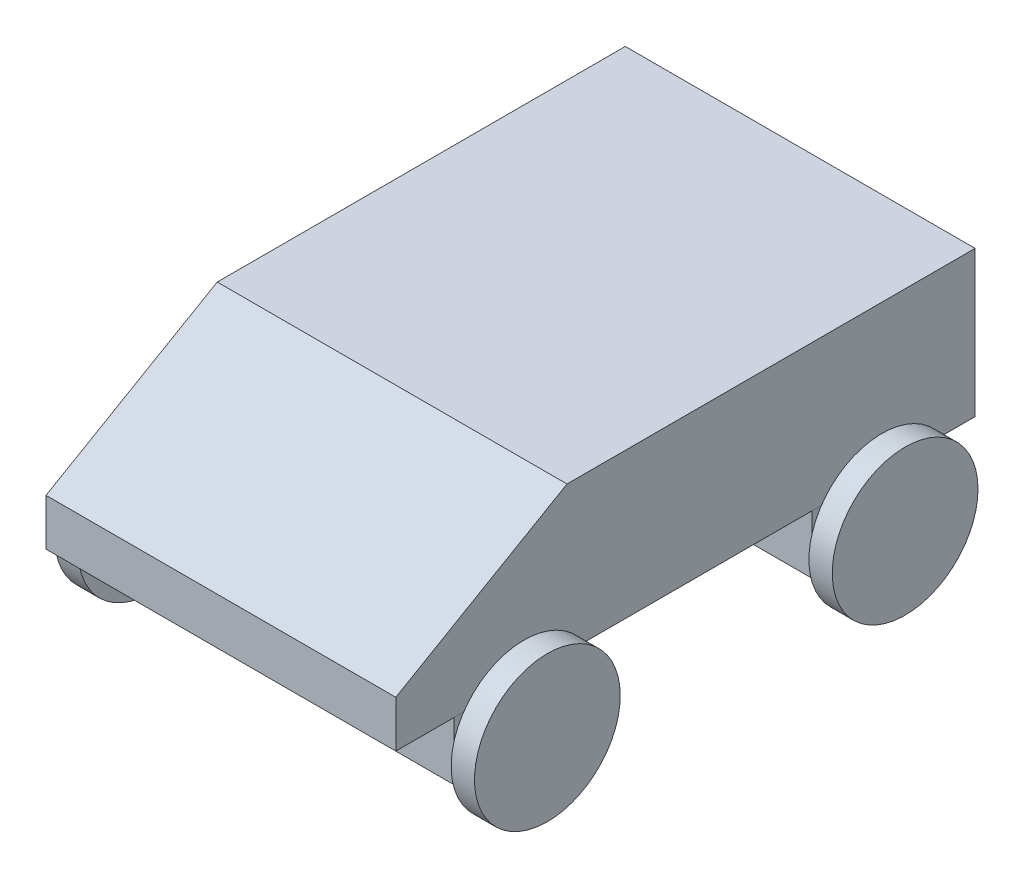
ISO-10303-21;
HEADER;
FILE_DESCRIPTION(('STEP AP214'),'2;1');
FILE_NAME('part.step','',(''),(''),'','','');
FILE_SCHEMA(('AUTOMOTIVE_DESIGN { 1 0 10303 214 1 1 1 1 }'));
ENDSEC;
DATA;
#1=APPLICATION_CONTEXT('core data for automotive mechanical design processes');
#2=APPLICATION_PROTOCOL_DEFINITION('international standard','automotive_design',2000,#1);
#3=PRODUCT_CONTEXT('',#1,'mechanical');
#4=PRODUCT('Part','Part','',(#3));
#5=PRODUCT_RELATED_PRODUCT_CATEGORY('part','',(#4));
#6=PRODUCT_DEFINITION_FORMATION('','',#4);
#7=PRODUCT_DEFINITION_CONTEXT('part definition',#1,'design');
#8=PRODUCT_DEFINITION('design','',#6,#7);
#9=PRODUCT_DEFINITION_SHAPE('','',#8);
#10=(LENGTH_UNIT() NAMED_UNIT(*) SI_UNIT(.MILLI.,.METRE.));
#11=(NAMED_UNIT(*) PLANE_ANGLE_UNIT() SI_UNIT($,.RADIAN.));
#12=(NAMED_UNIT(*) SI_UNIT($,.STERADIAN.) SOLID_ANGLE_UNIT());
#13=UNCERTAINTY_MEASURE_WITH_UNIT(LENGTH_MEASURE(1.E-05),#10,'distance_accuracy_value','');
#14=(GEOMETRIC_REPRESENTATION_CONTEXT(3) GLOBAL_UNCERTAINTY_ASSIGNED_CONTEXT((#13)) GLOBAL_UNIT_ASSIGNED_CONTEXT((#10,
#11,#12)) REPRESENTATION_CONTEXT('',''));
#15=CARTESIAN_POINT('',(0.,0.,0.));
#16=DIRECTION('',(0.,0.,1.));
#17=DIRECTION('',(1.,0.,0.));
#18=AXIS2_PLACEMENT_3D('',#15,#16,#17);
#19=CARTESIAN_POINT('',(0.,0.,0.));
#20=DIRECTION('',(-1.,0.,0.));
#21=DIRECTION('',(0.,0.,1.));
#22=AXIS2_PLACEMENT_3D('',#19,#20,#21);
#23=PLANE('',#22);
#24=DIRECTION('',(0.,0.,-1.));
#25=VECTOR('',#24,1.);
#26=CARTESIAN_POINT('',(0.,0.,37.3));
#27=LINE('',#26,#25);
#28=CARTESIAN_POINT('',(0.,0.,37.3));
#29=VERTEX_POINT('',#28);
#30=CARTESIAN_POINT('',(0.,0.,11.9));
#31=VERTEX_POINT('',#30);
#32=EDGE_CURVE('E12',#29,#31,#27,.T.);
#33=ORIENTED_EDGE('',*,*,#32,.T.);
#34=DIRECTION('',(0.,1.,0.));
#35=VECTOR('',#34,1.);
#36=CARTESIAN_POINT('',(0.,-12.7,11.9));
#37=LINE('',#36,#35);
#38=CARTESIAN_POINT('',(0.,-12.7,11.9));
#39=VERTEX_POINT('',#38);
#40=EDGE_CURVE('E121',#39,#31,#37,.T.);
#41=ORIENTED_EDGE('',*,*,#40,.F.);
#42=DIRECTION('',(0.,0.,-1.));
#43=VECTOR('',#42,1.);
#44=CARTESIAN_POINT('',(0.,-12.7,37.3));
#45=LINE('',#44,#43);
#46=CARTESIAN_POINT('',(0.,-12.7,37.3));
#47=VERTEX_POINT('',#46);
#48=EDGE_CURVE('E53',#47,#39,#45,.T.);
#49=ORIENTED_EDGE('',*,*,#48,.F.);
#50=DIRECTION('',(0.,1.,0.));
#51=VECTOR('',#50,1.);
#52=CARTESIAN_POINT('',(0.,-12.7,37.3));
#53=LINE('',#52,#51);
#54=EDGE_CURVE('E108',#47,#29,#53,.T.);
#55=ORIENTED_EDGE('',*,*,#54,.T.);
#56=EDGE_LOOP('',(#33,#41,#49,#55));
#57=FACE_BOUND('',#56,.T.);
#58=ADVANCED_FACE('F50',(#57),#23,.T.);
#59=CARTESIAN_POINT('',(0.,-12.7,11.9));
#60=DIRECTION('',(0.,0.,1.));
#61=DIRECTION('',(1.,0.,0.));
#62=AXIS2_PLACEMENT_3D('',#59,#60,#61);
#63=PLANE('',#62);
#64=DIRECTION('',(1.,0.,0.));
#65=VECTOR('',#64,1.);
#66=CARTESIAN_POINT('',(0.,0.,11.9));
#67=LINE('',#66,#65);
#68=CARTESIAN_POINT('',(19.05,0.,11.9));
#69=VERTEX_POINT('',#68);
#70=EDGE_CURVE('E59',#31,#69,#67,.T.);
#71=ORIENTED_EDGE('',*,*,#70,.T.);
#72=DIRECTION('',(0.,1.,0.));
#73=VECTOR('',#72,1.);
#74=CARTESIAN_POINT('',(19.05,-12.7,11.9));
#75=LINE('',#74,#73);
#76=CARTESIAN_POINT('',(19.05,-12.7,11.9));
#77=VERTEX_POINT('',#76);
#78=EDGE_CURVE('E104',#77,#69,#75,.T.);
#79=ORIENTED_EDGE('',*,*,#78,.F.);
#80=DIRECTION('',(1.,0.,0.));
#81=VECTOR('',#80,1.);
#82=CARTESIAN_POINT('',(0.,-12.7,11.9));
#83=LINE('',#82,#81);
#84=EDGE_CURVE('E83',#39,#77,#83,.T.);
#85=ORIENTED_EDGE('',*,*,#84,.F.);
#86=ORIENTED_EDGE('',*,*,#40,.T.);
#87=EDGE_LOOP('',(#71,#79,#85,#86));
#88=FACE_BOUND('',#87,.T.);
#89=ADVANCED_FACE('F124',(#88),#63,.F.);
#90=CARTESIAN_POINT('',(19.05,-12.7,37.3));
#91=DIRECTION('',(-1.,0.,0.));
#92=DIRECTION('',(0.,0.,1.));
#93=AXIS2_PLACEMENT_3D('',#90,#91,#92);
#94=PLANE('',#93);
#95=DIRECTION('',(0.,0.,1.));
#96=VECTOR('',#95,1.);
#97=CARTESIAN_POINT('',(19.05,0.,37.3));
#98=LINE('',#97,#96);
#99=CARTESIAN_POINT('',(19.05,0.,37.3));
#100=VERTEX_POINT('',#99);
#101=EDGE_CURVE('E99',#69,#100,#98,.T.);
#102=ORIENTED_EDGE('',*,*,#101,.T.);
#103=DIRECTION('',(0.,1.,0.));
#104=VECTOR('',#103,1.);
#105=CARTESIAN_POINT('',(19.05,-12.7,37.3));
#106=LINE('',#105,#104);
#107=CARTESIAN_POINT('',(19.05,-12.7,37.3));
#108=VERTEX_POINT('',#107);
#109=EDGE_CURVE('E102',#108,#100,#106,.T.);
#110=ORIENTED_EDGE('',*,*,#109,.F.);
#111=DIRECTION('',(0.,0.,1.));
#112=VECTOR('',#111,1.);
#113=CARTESIAN_POINT('',(19.05,-12.7,37.3));
#114=LINE('',#113,#112);
#115=EDGE_CURVE('E116',#77,#108,#114,.T.);
#116=ORIENTED_EDGE('',*,*,#115,.F.);
#117=ORIENTED_EDGE('',*,*,#78,.T.);
#118=EDGE_LOOP('',(#102,#110,#116,#117));
#119=FACE_BOUND('',#118,.T.);
#120=ADVANCED_FACE('F100',(#119),#94,.F.);
#121=CARTESIAN_POINT('',(0.,-12.7,37.3));
#122=DIRECTION('',(0.,0.,-1.));
#123=DIRECTION('',(-1.,0.,0.));
#124=AXIS2_PLACEMENT_3D('',#121,#122,#123);
#125=PLANE('',#124);
#126=DIRECTION('',(-1.,0.,0.));
#127=VECTOR('',#126,1.);
#128=CARTESIAN_POINT('',(0.,0.,37.3));
#129=LINE('',#128,#127);
#130=EDGE_CURVE('E93',#100,#29,#129,.T.);
#131=ORIENTED_EDGE('',*,*,#130,.T.);
#132=ORIENTED_EDGE('',*,*,#54,.F.);
#133=DIRECTION('',(-1.,0.,0.));
#134=VECTOR('',#133,1.);
#135=CARTESIAN_POINT('',(0.,-12.7,37.3));
#136=LINE('',#135,#134);
#137=EDGE_CURVE('E107',#108,#47,#136,.T.);
#138=ORIENTED_EDGE('',*,*,#137,.F.);
#139=ORIENTED_EDGE('',*,*,#109,.T.);
#140=EDGE_LOOP('',(#131,#132,#138,#139));
#141=FACE_BOUND('',#140,.T.);
#142=ADVANCED_FACE('F106',(#141),#125,.F.);
#143=CARTESIAN_POINT('',(0.,-12.7,0.));
#144=DIRECTION('',(0.,-1.,0.));
#145=DIRECTION('',(0.,0.,-1.));
#146=AXIS2_PLACEMENT_3D('',#143,#144,#145);
#147=PLANE('',#146);
#148=ORIENTED_EDGE('',*,*,#48,.T.);
#149=ORIENTED_EDGE('',*,*,#84,.T.);
#150=ORIENTED_EDGE('',*,*,#115,.T.);
#151=ORIENTED_EDGE('',*,*,#137,.T.);
#152=EDGE_LOOP('',(#148,#149,#150,#151));
#153=FACE_BOUND('',#152,.T.);
#154=ADVANCED_FACE('F117',(#153),#147,.T.);
#155=CARTESIAN_POINT('',(0.,0.,0.));
#156=DIRECTION('',(0.,-1.,0.));
#157=DIRECTION('',(0.,0.,-1.));
#158=AXIS2_PLACEMENT_3D('',#155,#156,#157);
#159=PLANE('',#158);
#160=ORIENTED_EDGE('',*,*,#32,.F.);
#161=ORIENTED_EDGE('',*,*,#130,.F.);
#162=ORIENTED_EDGE('',*,*,#101,.F.);
#163=ORIENTED_EDGE('',*,*,#70,.F.);
#164=EDGE_LOOP('',(#160,#161,#162,#163));
#165=FACE_BOUND('',#164,.T.);
#166=ADVANCED_FACE('F110',(#165),#159,.F.);
#167=CLOSED_SHELL('',(#58,#89,#120,#142,#154,#166));
#168=MANIFOLD_SOLID_BREP('B2',#167);
#169=CARTESIAN_POINT('',(0.,0.,0.));
#170=DIRECTION('',(-1.,0.,0.));
#171=DIRECTION('',(0.,0.,1.));
#172=AXIS2_PLACEMENT_3D('',#169,#170,#171);
#173=PLANE('',#172);
#174=CARTESIAN_POINT('',(0.,-6.35,24.6));
#175=DIRECTION('',(1.,0.,0.));
#176=DIRECTION('',(0.,0.,-1.));
#177=AXIS2_PLACEMENT_3D('',#174,#175,#176);
#178=CIRCLE('',#177,2.54);
#179=CARTESIAN_POINT('',(0.,-6.35,22.06));
#180=VERTEX_POINT('',#179);
#181=EDGE_CURVE('E49',#180,#180,#178,.T.);
#182=ORIENTED_EDGE('',*,*,#181,.T.);
#183=EDGE_LOOP('',(#182));
#184=FACE_BOUND('',#183,.T.);
#185=ADVANCED_FACE('F187',(#184),#173,.F.);
#186=CARTESIAN_POINT('',(-7.62,-6.35,24.6));
#187=DIRECTION('',(-1.,0.,0.));
#188=DIRECTION('',(0.,0.,-1.));
#189=AXIS2_PLACEMENT_3D('',#186,#187,#188);
#190=PLANE('',#189);
#191=CARTESIAN_POINT('',(-7.62,-6.35,24.6));
#192=DIRECTION('',(1.,0.,0.));
#193=DIRECTION('',(0.,0.,-1.));
#194=AXIS2_PLACEMENT_3D('',#191,#192,#193);
#195=CIRCLE('',#194,15.875);
#196=CARTESIAN_POINT('',(-7.62,-6.35,8.725));
#197=VERTEX_POINT('',#196);
#198=EDGE_CURVE('E198',#197,#197,#195,.T.);
#199=ORIENTED_EDGE('',*,*,#198,.F.);
#200=EDGE_LOOP('',(#199));
#201=FACE_BOUND('',#200,.T.);
#202=ADVANCED_FACE('F217',(#201),#190,.T.);
#203=CARTESIAN_POINT('',(-7.62,-6.35,24.6));
#204=DIRECTION('',(1.,0.,0.));
#205=DIRECTION('',(0.,0.,1.));
#206=AXIS2_PLACEMENT_3D('',#203,#204,#205);
#207=CYLINDRICAL_SURFACE('',#206,15.875);
#208=ORIENTED_EDGE('',*,*,#198,.T.);
#209=EDGE_LOOP('',(#208));
#210=FACE_BOUND('',#209,.T.);
#211=CARTESIAN_POINT('',(-2.54,-6.35,24.6));
#212=DIRECTION('',(1.,0.,0.));
#213=DIRECTION('',(0.,0.,-1.));
#214=AXIS2_PLACEMENT_3D('',#211,#212,#213);
#215=CIRCLE('',#214,15.875);
#216=CARTESIAN_POINT('',(-2.54,-6.35,8.725));
#217=VERTEX_POINT('',#216);
#218=EDGE_CURVE('E190',#217,#217,#215,.T.);
#219=ORIENTED_EDGE('',*,*,#218,.F.);
#220=EDGE_LOOP('',(#219));
#221=FACE_BOUND('',#220,.T.);
#222=ADVANCED_FACE('F213',(#210,#221),#207,.T.);
#223=CARTESIAN_POINT('',(-2.54,-6.35,24.6));
#224=DIRECTION('',(-1.,0.,0.));
#225=DIRECTION('',(0.,0.,-1.));
#226=AXIS2_PLACEMENT_3D('',#223,#224,#225);
#227=PLANE('',#226);
#228=CARTESIAN_POINT('',(-2.54,-6.35,24.6));
#229=DIRECTION('',(1.,0.,0.));
#230=DIRECTION('',(0.,0.,-1.));
#231=AXIS2_PLACEMENT_3D('',#228,#229,#230);
#232=CIRCLE('',#231,2.54);
#233=CARTESIAN_POINT('',(-2.54,-6.35,22.06));
#234=VERTEX_POINT('',#233);
#235=EDGE_CURVE('E200',#234,#234,#232,.T.);
#236=ORIENTED_EDGE('',*,*,#235,.F.);
#237=EDGE_LOOP('',(#236));
#238=FACE_BOUND('',#237,.T.);
#239=ORIENTED_EDGE('',*,*,#218,.T.);
#240=EDGE_LOOP('',(#239));
#241=FACE_BOUND('',#240,.T.);
#242=ADVANCED_FACE('F210',(#238,#241),#227,.F.);
#243=CARTESIAN_POINT('',(-2.54,-6.35,24.6));
#244=DIRECTION('',(1.,0.,0.));
#245=DIRECTION('',(0.,0.,1.));
#246=AXIS2_PLACEMENT_3D('',#243,#244,#245);
#247=CYLINDRICAL_SURFACE('',#246,2.54);
#248=ORIENTED_EDGE('',*,*,#235,.T.);
#249=EDGE_LOOP('',(#248));
#250=FACE_BOUND('',#249,.T.);
#251=ORIENTED_EDGE('',*,*,#181,.F.);
#252=EDGE_LOOP('',(#251));
#253=FACE_BOUND('',#252,.T.);
#254=ADVANCED_FACE('F207',(#250,#253),#247,.T.);
#255=CLOSED_SHELL('',(#185,#202,#222,#242,#254));
#256=MANIFOLD_SOLID_BREP('B6',#255);
#257=CARTESIAN_POINT('',(0.,0.,0.));
#258=DIRECTION('',(-1.,0.,0.));
#259=DIRECTION('',(0.,0.,1.));
#260=AXIS2_PLACEMENT_3D('',#257,#258,#259);
#261=PLANE('',#260);
#262=DIRECTION('',(0.,0.,-1.));
#263=VECTOR('',#262,1.);
#264=CARTESIAN_POINT('',(0.,0.,-40.64));
#265=LINE('',#264,#263);
#266=CARTESIAN_POINT('',(0.,0.,-40.64));
#267=VERTEX_POINT('',#266);
#268=CARTESIAN_POINT('',(0.,0.,-66.04));
#269=VERTEX_POINT('',#268);
#270=EDGE_CURVE('E185',#267,#269,#265,.T.);
#271=ORIENTED_EDGE('',*,*,#270,.T.);
#272=DIRECTION('',(0.,1.,0.));
#273=VECTOR('',#272,1.);
#274=CARTESIAN_POINT('',(0.,-12.7,-66.04));
#275=LINE('',#274,#273);
#276=CARTESIAN_POINT('',(0.,-12.7,-66.04));
#277=VERTEX_POINT('',#276);
#278=EDGE_CURVE('E337',#277,#269,#275,.T.);
#279=ORIENTED_EDGE('',*,*,#278,.F.);
#280=DIRECTION('',(0.,0.,-1.));
#281=VECTOR('',#280,1.);
#282=CARTESIAN_POINT('',(0.,-12.7,-40.64));
#283=LINE('',#282,#281);
#284=CARTESIAN_POINT('',(0.,-12.7,-40.64));
#285=VERTEX_POINT('',#284);
#286=EDGE_CURVE('E269',#285,#277,#283,.T.);
#287=ORIENTED_EDGE('',*,*,#286,.F.);
#288=DIRECTION('',(0.,1.,0.));
#289=VECTOR('',#288,1.);
#290=CARTESIAN_POINT('',(0.,-12.7,-40.64));
#291=LINE('',#290,#289);
#292=EDGE_CURVE('E324',#285,#267,#291,.T.);
#293=ORIENTED_EDGE('',*,*,#292,.T.);
#294=EDGE_LOOP('',(#271,#279,#287,#293));
#295=FACE_BOUND('',#294,.T.);
#296=ADVANCED_FACE('F266',(#295),#261,.T.);
#297=CARTESIAN_POINT('',(0.,-12.7,-66.04));
#298=DIRECTION('',(0.,0.,1.));
#299=DIRECTION('',(1.,0.,0.));
#300=AXIS2_PLACEMENT_3D('',#297,#298,#299);
#301=PLANE('',#300);
#302=DIRECTION('',(1.,0.,0.));
#303=VECTOR('',#302,1.);
#304=CARTESIAN_POINT('',(0.,0.,-66.04));
#305=LINE('',#304,#303);
#306=CARTESIAN_POINT('',(19.05,0.,-66.04));
#307=VERTEX_POINT('',#306);
#308=EDGE_CURVE('E275',#269,#307,#305,.T.);
#309=ORIENTED_EDGE('',*,*,#308,.T.);
#310=DIRECTION('',(0.,1.,0.));
#311=VECTOR('',#310,1.);
#312=CARTESIAN_POINT('',(19.05,-12.7,-66.04));
#313=LINE('',#312,#311);
#314=CARTESIAN_POINT('',(19.05,-12.7,-66.04));
#315=VERTEX_POINT('',#314);
#316=EDGE_CURVE('E320',#315,#307,#313,.T.);
#317=ORIENTED_EDGE('',*,*,#316,.F.);
#318=DIRECTION('',(1.,0.,0.));
#319=VECTOR('',#318,1.);
#320=CARTESIAN_POINT('',(0.,-12.7,-66.04));
#321=LINE('',#320,#319);
#322=EDGE_CURVE('E299',#277,#315,#321,.T.);
#323=ORIENTED_EDGE('',*,*,#322,.F.);
#324=ORIENTED_EDGE('',*,*,#278,.T.);
#325=EDGE_LOOP('',(#309,#317,#323,#324));
#326=FACE_BOUND('',#325,.T.);
#327=ADVANCED_FACE('F340',(#326),#301,.F.);
#328=CARTESIAN_POINT('',(19.05,-12.7,-40.64));
#329=DIRECTION('',(-1.,0.,0.));
#330=DIRECTION('',(0.,0.,1.));
#331=AXIS2_PLACEMENT_3D('',#328,#329,#330);
#332=PLANE('',#331);
#333=DIRECTION('',(0.,0.,1.));
#334=VECTOR('',#333,1.);
#335=CARTESIAN_POINT('',(19.05,0.,-40.64));
#336=LINE('',#335,#334);
#337=CARTESIAN_POINT('',(19.05,0.,-40.64));
#338=VERTEX_POINT('',#337);
#339=EDGE_CURVE('E315',#307,#338,#336,.T.);
#340=ORIENTED_EDGE('',*,*,#339,.T.);
#341=DIRECTION('',(0.,1.,0.));
#342=VECTOR('',#341,1.);
#343=CARTESIAN_POINT('',(19.05,-12.7,-40.64));
#344=LINE('',#343,#342);
#345=CARTESIAN_POINT('',(19.05,-12.7,-40.64));
#346=VERTEX_POINT('',#345);
#347=EDGE_CURVE('E318',#346,#338,#344,.T.);
#348=ORIENTED_EDGE('',*,*,#347,.F.);
#349=DIRECTION('',(0.,0.,1.));
#350=VECTOR('',#349,1.);
#351=CARTESIAN_POINT('',(19.05,-12.7,-40.64));
#352=LINE('',#351,#350);
#353=EDGE_CURVE('E332',#315,#346,#352,.T.);
#354=ORIENTED_EDGE('',*,*,#353,.F.);
#355=ORIENTED_EDGE('',*,*,#316,.T.);
#356=EDGE_LOOP('',(#340,#348,#354,#355));
#357=FACE_BOUND('',#356,.T.);
#358=ADVANCED_FACE('F316',(#357),#332,.F.);
#359=CARTESIAN_POINT('',(0.,-12.7,-40.64));
#360=DIRECTION('',(0.,0.,-1.));
#361=DIRECTION('',(-1.,0.,0.));
#362=AXIS2_PLACEMENT_3D('',#359,#360,#361);
#363=PLANE('',#362);
#364=DIRECTION('',(-1.,0.,0.));
#365=VECTOR('',#364,1.);
#366=CARTESIAN_POINT('',(0.,0.,-40.64));
#367=LINE('',#366,#365);
#368=EDGE_CURVE('E309',#338,#267,#367,.T.);
#369=ORIENTED_EDGE('',*,*,#368,.T.);
#370=ORIENTED_EDGE('',*,*,#292,.F.);
#371=DIRECTION('',(-1.,0.,0.));
#372=VECTOR('',#371,1.);
#373=CARTESIAN_POINT('',(0.,-12.7,-40.64));
#374=LINE('',#373,#372);
#375=EDGE_CURVE('E323',#346,#285,#374,.T.);
#376=ORIENTED_EDGE('',*,*,#375,.F.);
#377=ORIENTED_EDGE('',*,*,#347,.T.);
#378=EDGE_LOOP('',(#369,#370,#376,#377));
#379=FACE_BOUND('',#378,.T.);
#380=ADVANCED_FACE('F322',(#379),#363,.F.);
#381=CARTESIAN_POINT('',(0.,-12.7,0.));
#382=DIRECTION('',(0.,-1.,0.));
#383=DIRECTION('',(0.,0.,-1.));
#384=AXIS2_PLACEMENT_3D('',#381,#382,#383);
#385=PLANE('',#384);
#386=ORIENTED_EDGE('',*,*,#286,.T.);
#387=ORIENTED_EDGE('',*,*,#322,.T.);
#388=ORIENTED_EDGE('',*,*,#353,.T.);
#389=ORIENTED_EDGE('',*,*,#375,.T.);
#390=EDGE_LOOP('',(#386,#387,#388,#389));
#391=FACE_BOUND('',#390,.T.);
#392=ADVANCED_FACE('F333',(#391),#385,.T.);
#393=CARTESIAN_POINT('',(0.,0.,0.));
#394=DIRECTION('',(0.,-1.,0.));
#395=DIRECTION('',(0.,0.,-1.));
#396=AXIS2_PLACEMENT_3D('',#393,#394,#395);
#397=PLANE('',#396);
#398=ORIENTED_EDGE('',*,*,#270,.F.);
#399=ORIENTED_EDGE('',*,*,#368,.F.);
#400=ORIENTED_EDGE('',*,*,#339,.F.);
#401=ORIENTED_EDGE('',*,*,#308,.F.);
#402=EDGE_LOOP('',(#398,#399,#400,#401));
#403=FACE_BOUND('',#402,.T.);
#404=ADVANCED_FACE('F326',(#403),#397,.F.);
#405=CLOSED_SHELL('',(#296,#327,#358,#380,#392,#404));
#406=MANIFOLD_SOLID_BREP('B44',#405);
#407=CARTESIAN_POINT('',(0.,0.,0.));
#408=DIRECTION('',(-1.,0.,0.));
#409=DIRECTION('',(0.,0.,1.));
#410=AXIS2_PLACEMENT_3D('',#407,#408,#409);
#411=PLANE('',#410);
#412=CARTESIAN_POINT('',(0.,-6.35,-53.34));
#413=DIRECTION('',(1.,0.,0.));
#414=DIRECTION('',(0.,0.,-1.));
#415=AXIS2_PLACEMENT_3D('',#412,#413,#414);
#416=CIRCLE('',#415,2.54);
#417=CARTESIAN_POINT('',(0.,-6.35,-55.88));
#418=VERTEX_POINT('',#417);
#419=EDGE_CURVE('E265',#418,#418,#416,.T.);
#420=ORIENTED_EDGE('',*,*,#419,.T.);
#421=EDGE_LOOP('',(#420));
#422=FACE_BOUND('',#421,.T.);
#423=ADVANCED_FACE('F401',(#422),#411,.F.);
#424=CARTESIAN_POINT('',(-7.62,-6.35,-53.34));
#425=DIRECTION('',(-1.,0.,0.));
#426=DIRECTION('',(0.,0.,-1.));
#427=AXIS2_PLACEMENT_3D('',#424,#425,#426);
#428=PLANE('',#427);
#429=CARTESIAN_POINT('',(-7.62,-6.35,-53.34));
#430=DIRECTION('',(1.,0.,0.));
#431=DIRECTION('',(0.,0.,-1.));
#432=AXIS2_PLACEMENT_3D('',#429,#430,#431);
#433=CIRCLE('',#432,15.875);
#434=CARTESIAN_POINT('',(-7.62,-6.35,-69.215));
#435=VERTEX_POINT('',#434);
#436=EDGE_CURVE('E412',#435,#435,#433,.T.);
#437=ORIENTED_EDGE('',*,*,#436,.F.);
#438=EDGE_LOOP('',(#437));
#439=FACE_BOUND('',#438,.T.);
#440=ADVANCED_FACE('F431',(#439),#428,.T.);
#441=CARTESIAN_POINT('',(-7.62,-6.35,-53.34));
#442=DIRECTION('',(1.,0.,0.));
#443=DIRECTION('',(0.,0.,1.));
#444=AXIS2_PLACEMENT_3D('',#441,#442,#443);
#445=CYLINDRICAL_SURFACE('',#444,15.875);
#446=ORIENTED_EDGE('',*,*,#436,.T.);
#447=EDGE_LOOP('',(#446));
#448=FACE_BOUND('',#447,.T.);
#449=CARTESIAN_POINT('',(-2.54,-6.35,-53.34));
#450=DIRECTION('',(1.,0.,0.));
#451=DIRECTION('',(0.,0.,-1.));
#452=AXIS2_PLACEMENT_3D('',#449,#450,#451);
#453=CIRCLE('',#452,15.875);
#454=CARTESIAN_POINT('',(-2.54,-6.35,-69.215));
#455=VERTEX_POINT('',#454);
#456=EDGE_CURVE('E404',#455,#455,#453,.T.);
#457=ORIENTED_EDGE('',*,*,#456,.F.);
#458=EDGE_LOOP('',(#457));
#459=FACE_BOUND('',#458,.T.);
#460=ADVANCED_FACE('F427',(#448,#459),#445,.T.);
#461=CARTESIAN_POINT('',(-2.54,-6.35,-53.34));
#462=DIRECTION('',(-1.,0.,0.));
#463=DIRECTION('',(0.,0.,-1.));
#464=AXIS2_PLACEMENT_3D('',#461,#462,#463);
#465=PLANE('',#464);
#466=CARTESIAN_POINT('',(-2.54,-6.35,-53.34));
#467=DIRECTION('',(1.,0.,0.));
#468=DIRECTION('',(0.,0.,-1.));
#469=AXIS2_PLACEMENT_3D('',#466,#467,#468);
#470=CIRCLE('',#469,2.54);
#471=CARTESIAN_POINT('',(-2.54,-6.35,-55.88));
#472=VERTEX_POINT('',#471);
#473=EDGE_CURVE('E414',#472,#472,#470,.T.);
#474=ORIENTED_EDGE('',*,*,#473,.F.);
#475=EDGE_LOOP('',(#474));
#476=FACE_BOUND('',#475,.T.);
#477=ORIENTED_EDGE('',*,*,#456,.T.);
#478=EDGE_LOOP('',(#477));
#479=FACE_BOUND('',#478,.T.);
#480=ADVANCED_FACE('F424',(#476,#479),#465,.F.);
#481=CARTESIAN_POINT('',(-2.54,-6.35,-53.34));
#482=DIRECTION('',(1.,0.,0.));
#483=DIRECTION('',(0.,0.,1.));
#484=AXIS2_PLACEMENT_3D('',#481,#482,#483);
#485=CYLINDRICAL_SURFACE('',#484,2.54);
#486=ORIENTED_EDGE('',*,*,#473,.T.);
#487=EDGE_LOOP('',(#486));
#488=FACE_BOUND('',#487,.T.);
#489=ORIENTED_EDGE('',*,*,#419,.F.);
#490=EDGE_LOOP('',(#489));
#491=FACE_BOUND('',#490,.T.);
#492=ADVANCED_FACE('F421',(#488,#491),#485,.T.);
#493=CLOSED_SHELL('',(#423,#440,#460,#480,#492));
#494=MANIFOLD_SOLID_BREP('B179',#493);
#495=CARTESIAN_POINT('',(78.74,-6.35,-53.34));
#496=DIRECTION('',(-1.,0.,0.));
#497=DIRECTION('',(0.,0.,1.));
#498=AXIS2_PLACEMENT_3D('',#495,#496,#497);
#499=CYLINDRICAL_SURFACE('',#498,2.54);
#500=CARTESIAN_POINT('',(78.74,-6.35,-53.34));
#501=DIRECTION('',(1.,0.,0.));
#502=DIRECTION('',(0.,0.,-1.));
#503=AXIS2_PLACEMENT_3D('',#500,#501,#502);
#504=CIRCLE('',#503,2.54);
#505=CARTESIAN_POINT('',(78.74,-6.35,-55.88));
#506=VERTEX_POINT('',#505);
#507=EDGE_CURVE('E400',#506,#506,#504,.T.);
#508=ORIENTED_EDGE('',*,*,#507,.F.);
#509=EDGE_LOOP('',(#508));
#510=FACE_BOUND('',#509,.T.);
#511=CARTESIAN_POINT('',(76.2,-6.35,-53.34));
#512=DIRECTION('',(1.,0.,0.));
#513=DIRECTION('',(0.,0.,-1.));
#514=AXIS2_PLACEMENT_3D('',#511,#512,#513);
#515=CIRCLE('',#514,2.54);
#516=CARTESIAN_POINT('',(76.2,-6.35,-55.88));
#517=VERTEX_POINT('',#516);
#518=EDGE_CURVE('E482',#517,#517,#515,.T.);
#519=ORIENTED_EDGE('',*,*,#518,.T.);
#520=EDGE_LOOP('',(#519));
#521=FACE_BOUND('',#520,.T.);
#522=ADVANCED_FACE('F479',(#510,#521),#499,.T.);
#523=CARTESIAN_POINT('',(76.2,-6.35,-53.34));
#524=DIRECTION('',(1.,0.,0.));
#525=DIRECTION('',(0.,0.,-1.));
#526=AXIS2_PLACEMENT_3D('',#523,#524,#525);
#527=PLANE('',#526);
#528=ORIENTED_EDGE('',*,*,#518,.F.);
#529=EDGE_LOOP('',(#528));
#530=FACE_BOUND('',#529,.T.);
#531=ADVANCED_FACE('F502',(#530),#527,.F.);
#532=CARTESIAN_POINT('',(83.82,-6.35,-53.34));
#533=DIRECTION('',(-1.,0.,0.));
#534=DIRECTION('',(0.,0.,1.));
#535=AXIS2_PLACEMENT_3D('',#532,#533,#534);
#536=CYLINDRICAL_SURFACE('',#535,15.875);
#537=CARTESIAN_POINT('',(83.82,-6.35,-53.34));
#538=DIRECTION('',(1.,0.,0.));
#539=DIRECTION('',(0.,0.,-1.));
#540=AXIS2_PLACEMENT_3D('',#537,#538,#539);
#541=CIRCLE('',#540,15.875);
#542=CARTESIAN_POINT('',(83.82,-6.35,-69.215));
#543=VERTEX_POINT('',#542);
#544=EDGE_CURVE('E489',#543,#543,#541,.T.);
#545=ORIENTED_EDGE('',*,*,#544,.F.);
#546=EDGE_LOOP('',(#545));
#547=FACE_BOUND('',#546,.T.);
#548=CARTESIAN_POINT('',(78.74,-6.35,-53.34));
#549=DIRECTION('',(1.,0.,0.));
#550=DIRECTION('',(0.,0.,-1.));
#551=AXIS2_PLACEMENT_3D('',#548,#549,#550);
#552=CIRCLE('',#551,15.875);
#553=CARTESIAN_POINT('',(78.74,-6.35,-69.215));
#554=VERTEX_POINT('',#553);
#555=EDGE_CURVE('E491',#554,#554,#552,.T.);
#556=ORIENTED_EDGE('',*,*,#555,.T.);
#557=EDGE_LOOP('',(#556));
#558=FACE_BOUND('',#557,.T.);
#559=ADVANCED_FACE('F499',(#547,#558),#536,.T.);
#560=CARTESIAN_POINT('',(83.82,-6.35,-53.34));
#561=DIRECTION('',(1.,0.,0.));
#562=DIRECTION('',(0.,0.,-1.));
#563=AXIS2_PLACEMENT_3D('',#560,#561,#562);
#564=PLANE('',#563);
#565=ORIENTED_EDGE('',*,*,#544,.T.);
#566=EDGE_LOOP('',(#565));
#567=FACE_BOUND('',#566,.T.);
#568=ADVANCED_FACE('F497',(#567),#564,.T.);
#569=CARTESIAN_POINT('',(78.74,-6.35,-53.34));
#570=DIRECTION('',(1.,0.,0.));
#571=DIRECTION('',(0.,0.,-1.));
#572=AXIS2_PLACEMENT_3D('',#569,#570,#571);
#573=PLANE('',#572);
#574=ORIENTED_EDGE('',*,*,#507,.T.);
#575=EDGE_LOOP('',(#574));
#576=FACE_BOUND('',#575,.T.);
#577=ORIENTED_EDGE('',*,*,#555,.F.);
#578=EDGE_LOOP('',(#577));
#579=FACE_BOUND('',#578,.T.);
#580=ADVANCED_FACE('F506',(#576,#579),#573,.F.);
#581=CLOSED_SHELL('',(#522,#531,#559,#568,#580));
#582=MANIFOLD_SOLID_BREP('B260',#581);
#583=CARTESIAN_POINT('',(78.74,-6.35,24.6));
#584=DIRECTION('',(-1.,0.,0.));
#585=DIRECTION('',(0.,0.,1.));
#586=AXIS2_PLACEMENT_3D('',#583,#584,#585);
#587=CYLINDRICAL_SURFACE('',#586,2.54);
#588=CARTESIAN_POINT('',(78.74,-6.35,24.6));
#589=DIRECTION('',(1.,0.,0.));
#590=DIRECTION('',(0.,0.,-1.));
#591=AXIS2_PLACEMENT_3D('',#588,#589,#590);
#592=CIRCLE('',#591,2.54);
#593=CARTESIAN_POINT('',(78.74,-6.35,22.06));
#594=VERTEX_POINT('',#593);
#595=EDGE_CURVE('E478',#594,#594,#592,.T.);
#596=ORIENTED_EDGE('',*,*,#595,.F.);
#597=EDGE_LOOP('',(#596));
#598=FACE_BOUND('',#597,.T.);
#599=CARTESIAN_POINT('',(76.2,-6.35,24.6));
#600=DIRECTION('',(1.,0.,0.));
#601=DIRECTION('',(0.,0.,-1.));
#602=AXIS2_PLACEMENT_3D('',#599,#600,#601);
#603=CIRCLE('',#602,2.54);
#604=CARTESIAN_POINT('',(76.2,-6.35,22.06));
#605=VERTEX_POINT('',#604);
#606=EDGE_CURVE('E562',#605,#605,#603,.T.);
#607=ORIENTED_EDGE('',*,*,#606,.T.);
#608=EDGE_LOOP('',(#607));
#609=FACE_BOUND('',#608,.T.);
#610=ADVANCED_FACE('F559',(#598,#609),#587,.T.);
#611=CARTESIAN_POINT('',(76.2,-6.35,24.6));
#612=DIRECTION('',(1.,0.,0.));
#613=DIRECTION('',(0.,0.,-1.));
#614=AXIS2_PLACEMENT_3D('',#611,#612,#613);
#615=PLANE('',#614);
#616=ORIENTED_EDGE('',*,*,#606,.F.);
#617=EDGE_LOOP('',(#616));
#618=FACE_BOUND('',#617,.T.);
#619=ADVANCED_FACE('F582',(#618),#615,.F.);
#620=CARTESIAN_POINT('',(83.82,-6.35,24.6));
#621=DIRECTION('',(-1.,0.,0.));
#622=DIRECTION('',(0.,0.,1.));
#623=AXIS2_PLACEMENT_3D('',#620,#621,#622);
#624=CYLINDRICAL_SURFACE('',#623,15.875);
#625=CARTESIAN_POINT('',(83.82,-6.35,24.6));
#626=DIRECTION('',(1.,0.,0.));
#627=DIRECTION('',(0.,0.,-1.));
#628=AXIS2_PLACEMENT_3D('',#625,#626,#627);
#629=CIRCLE('',#628,15.875);
#630=CARTESIAN_POINT('',(83.82,-6.35,8.725));
#631=VERTEX_POINT('',#630);
#632=EDGE_CURVE('E569',#631,#631,#629,.T.);
#633=ORIENTED_EDGE('',*,*,#632,.F.);
#634=EDGE_LOOP('',(#633));
#635=FACE_BOUND('',#634,.T.);
#636=CARTESIAN_POINT('',(78.74,-6.35,24.6));
#637=DIRECTION('',(1.,0.,0.));
#638=DIRECTION('',(0.,0.,-1.));
#639=AXIS2_PLACEMENT_3D('',#636,#637,#638);
#640=CIRCLE('',#639,15.875);
#641=CARTESIAN_POINT('',(78.74,-6.35,8.725));
#642=VERTEX_POINT('',#641);
#643=EDGE_CURVE('E571',#642,#642,#640,.T.);
#644=ORIENTED_EDGE('',*,*,#643,.T.);
#645=EDGE_LOOP('',(#644));
#646=FACE_BOUND('',#645,.T.);
#647=ADVANCED_FACE('F579',(#635,#646),#624,.T.);
#648=CARTESIAN_POINT('',(83.82,-6.35,24.6));
#649=DIRECTION('',(1.,0.,0.));
#650=DIRECTION('',(0.,0.,-1.));
#651=AXIS2_PLACEMENT_3D('',#648,#649,#650);
#652=PLANE('',#651);
#653=ORIENTED_EDGE('',*,*,#632,.T.);
#654=EDGE_LOOP('',(#653));
#655=FACE_BOUND('',#654,.T.);
#656=ADVANCED_FACE('F577',(#655),#652,.T.);
#657=CARTESIAN_POINT('',(78.74,-6.35,24.6));
#658=DIRECTION('',(1.,0.,0.));
#659=DIRECTION('',(0.,0.,-1.));
#660=AXIS2_PLACEMENT_3D('',#657,#658,#659);
#661=PLANE('',#660);
#662=ORIENTED_EDGE('',*,*,#595,.T.);
#663=EDGE_LOOP('',(#662));
#664=FACE_BOUND('',#663,.T.);
#665=ORIENTED_EDGE('',*,*,#643,.F.);
#666=EDGE_LOOP('',(#665));
#667=FACE_BOUND('',#666,.T.);
#668=ADVANCED_FACE('F586',(#664,#667),#661,.F.);
#669=CLOSED_SHELL('',(#610,#619,#647,#656,#668));
#670=MANIFOLD_SOLID_BREP('B395',#669);
#671=CARTESIAN_POINT('',(76.2,-12.7,-40.64));
#672=DIRECTION('',(-1.,0.,0.));
#673=DIRECTION('',(0.,0.,1.));
#674=AXIS2_PLACEMENT_3D('',#671,#672,#673);
#675=PLANE('',#674);
#676=DIRECTION('',(0.,0.,1.));
#677=VECTOR('',#676,1.);
#678=CARTESIAN_POINT('',(76.2,0.,-40.64));
#679=LINE('',#678,#677);
#680=CARTESIAN_POINT('',(76.2,0.,-66.04));
#681=VERTEX_POINT('',#680);
#682=CARTESIAN_POINT('',(76.2,0.,-40.64));
#683=VERTEX_POINT('',#682);
#684=EDGE_CURVE('E703',#681,#683,#679,.T.);
#685=ORIENTED_EDGE('',*,*,#684,.T.);
#686=DIRECTION('',(0.,1.,0.));
#687=VECTOR('',#686,1.);
#688=CARTESIAN_POINT('',(76.2,-12.7,-40.64));
#689=LINE('',#688,#687);
#690=CARTESIAN_POINT('',(76.2,-12.7,-40.64));
#691=VERTEX_POINT('',#690);
#692=EDGE_CURVE('E557',#691,#683,#689,.T.);
#693=ORIENTED_EDGE('',*,*,#692,.F.);
#694=DIRECTION('',(0.,0.,1.));
#695=VECTOR('',#694,1.);
#696=CARTESIAN_POINT('',(76.2,-12.7,-40.64));
#697=LINE('',#696,#695);
#698=CARTESIAN_POINT('',(76.2,-12.7,-66.04));
#699=VERTEX_POINT('',#698);
#700=EDGE_CURVE('E691',#699,#691,#697,.T.);
#701=ORIENTED_EDGE('',*,*,#700,.F.);
#702=DIRECTION('',(0.,1.,0.));
#703=VECTOR('',#702,1.);
#704=CARTESIAN_POINT('',(76.2,-12.7,-66.04));
#705=LINE('',#704,#703);
#706=EDGE_CURVE('E699',#699,#681,#705,.T.);
#707=ORIENTED_EDGE('',*,*,#706,.T.);
#708=EDGE_LOOP('',(#685,#693,#701,#707));
#709=FACE_BOUND('',#708,.T.);
#710=ADVANCED_FACE('F640',(#709),#675,.F.);
#711=CARTESIAN_POINT('',(76.2,-12.7,-40.64));
#712=DIRECTION('',(0.,0.,-1.));
#713=DIRECTION('',(-1.,0.,0.));
#714=AXIS2_PLACEMENT_3D('',#711,#712,#713);
#715=PLANE('',#714);
#716=DIRECTION('',(-1.,0.,0.));
#717=VECTOR('',#716,1.);
#718=CARTESIAN_POINT('',(76.2,0.,-40.64));
#719=LINE('',#718,#717);
#720=CARTESIAN_POINT('',(57.15,0.,-40.64));
#721=VERTEX_POINT('',#720);
#722=EDGE_CURVE('E695',#683,#721,#719,.T.);
#723=ORIENTED_EDGE('',*,*,#722,.T.);
#724=DIRECTION('',(0.,1.,0.));
#725=VECTOR('',#724,1.);
#726=CARTESIAN_POINT('',(57.15,-12.7,-40.64));
#727=LINE('',#726,#725);
#728=CARTESIAN_POINT('',(57.15,-12.7,-40.64));
#729=VERTEX_POINT('',#728);
#730=EDGE_CURVE('E648',#729,#721,#727,.T.);
#731=ORIENTED_EDGE('',*,*,#730,.F.);
#732=DIRECTION('',(-1.,0.,0.));
#733=VECTOR('',#732,1.);
#734=CARTESIAN_POINT('',(76.2,-12.7,-40.64));
#735=LINE('',#734,#733);
#736=EDGE_CURVE('E686',#691,#729,#735,.T.);
#737=ORIENTED_EDGE('',*,*,#736,.F.);
#738=ORIENTED_EDGE('',*,*,#692,.T.);
#739=EDGE_LOOP('',(#723,#731,#737,#738));
#740=FACE_BOUND('',#739,.T.);
#741=ADVANCED_FACE('F694',(#740),#715,.F.);
#742=CARTESIAN_POINT('',(57.15,-12.7,-40.64));
#743=DIRECTION('',(1.,0.,0.));
#744=DIRECTION('',(0.,0.,-1.));
#745=AXIS2_PLACEMENT_3D('',#742,#743,#744);
#746=PLANE('',#745);
#747=DIRECTION('',(0.,0.,-1.));
#748=VECTOR('',#747,1.);
#749=CARTESIAN_POINT('',(57.15,0.,-40.64));
#750=LINE('',#749,#748);
#751=CARTESIAN_POINT('',(57.15,0.,-66.04));
#752=VERTEX_POINT('',#751);
#753=EDGE_CURVE('E673',#721,#752,#750,.T.);
#754=ORIENTED_EDGE('',*,*,#753,.T.);
#755=DIRECTION('',(0.,1.,0.));
#756=VECTOR('',#755,1.);
#757=CARTESIAN_POINT('',(57.15,-12.7,-66.04));
#758=LINE('',#757,#756);
#759=CARTESIAN_POINT('',(57.15,-12.7,-66.04));
#760=VERTEX_POINT('',#759);
#761=EDGE_CURVE('E696',#760,#752,#758,.T.);
#762=ORIENTED_EDGE('',*,*,#761,.F.);
#763=DIRECTION('',(0.,0.,-1.));
#764=VECTOR('',#763,1.);
#765=CARTESIAN_POINT('',(57.15,-12.7,-40.64));
#766=LINE('',#765,#764);
#767=EDGE_CURVE('E689',#729,#760,#766,.T.);
#768=ORIENTED_EDGE('',*,*,#767,.F.);
#769=ORIENTED_EDGE('',*,*,#730,.T.);
#770=EDGE_LOOP('',(#754,#762,#768,#769));
#771=FACE_BOUND('',#770,.T.);
#772=ADVANCED_FACE('F697',(#771),#746,.F.);
#773=CARTESIAN_POINT('',(76.2,-12.7,-66.04));
#774=DIRECTION('',(0.,0.,1.));
#775=DIRECTION('',(1.,0.,0.));
#776=AXIS2_PLACEMENT_3D('',#773,#774,#775);
#777=PLANE('',#776);
#778=DIRECTION('',(1.,0.,0.));
#779=VECTOR('',#778,1.);
#780=CARTESIAN_POINT('',(76.2,0.,-66.04));
#781=LINE('',#780,#779);
#782=EDGE_CURVE('E679',#752,#681,#781,.T.);
#783=ORIENTED_EDGE('',*,*,#782,.T.);
#784=ORIENTED_EDGE('',*,*,#706,.F.);
#785=DIRECTION('',(1.,0.,0.));
#786=VECTOR('',#785,1.);
#787=CARTESIAN_POINT('',(76.2,-12.7,-66.04));
#788=LINE('',#787,#786);
#789=EDGE_CURVE('E656',#760,#699,#788,.T.);
#790=ORIENTED_EDGE('',*,*,#789,.F.);
#791=ORIENTED_EDGE('',*,*,#761,.T.);
#792=EDGE_LOOP('',(#783,#784,#790,#791));
#793=FACE_BOUND('',#792,.T.);
#794=ADVANCED_FACE('F710',(#793),#777,.F.);
#795=CARTESIAN_POINT('',(0.,-12.7,0.));
#796=DIRECTION('',(0.,1.,0.));
#797=DIRECTION('',(0.,0.,1.));
#798=AXIS2_PLACEMENT_3D('',#795,#796,#797);
#799=PLANE('',#798);
#800=ORIENTED_EDGE('',*,*,#700,.T.);
#801=ORIENTED_EDGE('',*,*,#736,.T.);
#802=ORIENTED_EDGE('',*,*,#767,.T.);
#803=ORIENTED_EDGE('',*,*,#789,.T.);
#804=EDGE_LOOP('',(#800,#801,#802,#803));
#805=FACE_BOUND('',#804,.T.);
#806=ADVANCED_FACE('F687',(#805),#799,.F.);
#807=CARTESIAN_POINT('',(0.,0.,0.));
#808=DIRECTION('',(0.,1.,0.));
#809=DIRECTION('',(0.,0.,1.));
#810=AXIS2_PLACEMENT_3D('',#807,#808,#809);
#811=PLANE('',#810);
#812=ORIENTED_EDGE('',*,*,#684,.F.);
#813=ORIENTED_EDGE('',*,*,#782,.F.);
#814=ORIENTED_EDGE('',*,*,#753,.F.);
#815=ORIENTED_EDGE('',*,*,#722,.F.);
#816=EDGE_LOOP('',(#812,#813,#814,#815));
#817=FACE_BOUND('',#816,.T.);
#818=ADVANCED_FACE('F713',(#817),#811,.T.);
#819=CLOSED_SHELL('',(#710,#741,#772,#794,#806,#818));
#820=MANIFOLD_SOLID_BREP('B473',#819);
#821=CARTESIAN_POINT('',(76.2,-12.7,37.3));
#822=DIRECTION('',(-1.,0.,0.));
#823=DIRECTION('',(0.,0.,1.));
#824=AXIS2_PLACEMENT_3D('',#821,#822,#823);
#825=PLANE('',#824);
#826=DIRECTION('',(0.,0.,1.));
#827=VECTOR('',#826,1.);
#828=CARTESIAN_POINT('',(76.2,0.,37.3));
#829=LINE('',#828,#827);
#830=CARTESIAN_POINT('',(76.2,0.,11.9));
#831=VERTEX_POINT('',#830);
#832=CARTESIAN_POINT('',(76.2,0.,37.3));
#833=VERTEX_POINT('',#832);
#834=EDGE_CURVE('E836',#831,#833,#829,.T.);
#835=ORIENTED_EDGE('',*,*,#834,.T.);
#836=DIRECTION('',(0.,1.,0.));
#837=VECTOR('',#836,1.);
#838=CARTESIAN_POINT('',(76.2,-12.7,37.3));
#839=LINE('',#838,#837);
#840=CARTESIAN_POINT('',(76.2,-12.7,37.3));
#841=VERTEX_POINT('',#840);
#842=EDGE_CURVE('E638',#841,#833,#839,.T.);
#843=ORIENTED_EDGE('',*,*,#842,.F.);
#844=DIRECTION('',(0.,0.,1.));
#845=VECTOR('',#844,1.);
#846=CARTESIAN_POINT('',(76.2,-12.7,37.3));
#847=LINE('',#846,#845);
#848=CARTESIAN_POINT('',(76.2,-12.7,11.9));
#849=VERTEX_POINT('',#848);
#850=EDGE_CURVE('E824',#849,#841,#847,.T.);
#851=ORIENTED_EDGE('',*,*,#850,.F.);
#852=DIRECTION('',(0.,1.,0.));
#853=VECTOR('',#852,1.);
#854=CARTESIAN_POINT('',(76.2,-12.7,11.9));
#855=LINE('',#854,#853);
#856=EDGE_CURVE('E832',#849,#831,#855,.T.);
#857=ORIENTED_EDGE('',*,*,#856,.T.);
#858=EDGE_LOOP('',(#835,#843,#851,#857));
#859=FACE_BOUND('',#858,.T.);
#860=ADVANCED_FACE('F773',(#859),#825,.F.);
#861=CARTESIAN_POINT('',(76.2,-12.7,37.3));
#862=DIRECTION('',(0.,0.,-1.));
#863=DIRECTION('',(-1.,0.,0.));
#864=AXIS2_PLACEMENT_3D('',#861,#862,#863);
#865=PLANE('',#864);
#866=DIRECTION('',(-1.,0.,0.));
#867=VECTOR('',#866,1.);
#868=CARTESIAN_POINT('',(76.2,0.,37.3));
#869=LINE('',#868,#867);
#870=CARTESIAN_POINT('',(57.15,0.,37.3));
#871=VERTEX_POINT('',#870);
#872=EDGE_CURVE('E828',#833,#871,#869,.T.);
#873=ORIENTED_EDGE('',*,*,#872,.T.);
#874=DIRECTION('',(0.,1.,0.));
#875=VECTOR('',#874,1.);
#876=CARTESIAN_POINT('',(57.15,-12.7,37.3));
#877=LINE('',#876,#875);
#878=CARTESIAN_POINT('',(57.15,-12.7,37.3));
#879=VERTEX_POINT('',#878);
#880=EDGE_CURVE('E781',#879,#871,#877,.T.);
#881=ORIENTED_EDGE('',*,*,#880,.F.);
#882=DIRECTION('',(-1.,0.,0.));
#883=VECTOR('',#882,1.);
#884=CARTESIAN_POINT('',(76.2,-12.7,37.3));
#885=LINE('',#884,#883);
#886=EDGE_CURVE('E819',#841,#879,#885,.T.);
#887=ORIENTED_EDGE('',*,*,#886,.F.);
#888=ORIENTED_EDGE('',*,*,#842,.T.);
#889=EDGE_LOOP('',(#873,#881,#887,#888));
#890=FACE_BOUND('',#889,.T.);
#891=ADVANCED_FACE('F827',(#890),#865,.F.);
#892=CARTESIAN_POINT('',(57.15,-12.7,37.3));
#893=DIRECTION('',(1.,0.,0.));
#894=DIRECTION('',(0.,0.,-1.));
#895=AXIS2_PLACEMENT_3D('',#892,#893,#894);
#896=PLANE('',#895);
#897=DIRECTION('',(0.,0.,-1.));
#898=VECTOR('',#897,1.);
#899=CARTESIAN_POINT('',(57.15,0.,37.3));
#900=LINE('',#899,#898);
#901=CARTESIAN_POINT('',(57.15,0.,11.9));
#902=VERTEX_POINT('',#901);
#903=EDGE_CURVE('E806',#871,#902,#900,.T.);
#904=ORIENTED_EDGE('',*,*,#903,.T.);
#905=DIRECTION('',(0.,1.,0.));
#906=VECTOR('',#905,1.);
#907=CARTESIAN_POINT('',(57.15,-12.7,11.9));
#908=LINE('',#907,#906);
#909=CARTESIAN_POINT('',(57.15,-12.7,11.9));
#910=VERTEX_POINT('',#909);
#911=EDGE_CURVE('E829',#910,#902,#908,.T.);
#912=ORIENTED_EDGE('',*,*,#911,.F.);
#913=DIRECTION('',(0.,0.,-1.));
#914=VECTOR('',#913,1.);
#915=CARTESIAN_POINT('',(57.15,-12.7,37.3));
#916=LINE('',#915,#914);
#917=EDGE_CURVE('E822',#879,#910,#916,.T.);
#918=ORIENTED_EDGE('',*,*,#917,.F.);
#919=ORIENTED_EDGE('',*,*,#880,.T.);
#920=EDGE_LOOP('',(#904,#912,#918,#919));
#921=FACE_BOUND('',#920,.T.);
#922=ADVANCED_FACE('F830',(#921),#896,.F.);
#923=CARTESIAN_POINT('',(76.2,-12.7,11.9));
#924=DIRECTION('',(0.,0.,1.));
#925=DIRECTION('',(1.,0.,0.));
#926=AXIS2_PLACEMENT_3D('',#923,#924,#925);
#927=PLANE('',#926);
#928=DIRECTION('',(1.,0.,0.));
#929=VECTOR('',#928,1.);
#930=CARTESIAN_POINT('',(76.2,0.,11.9));
#931=LINE('',#930,#929);
#932=EDGE_CURVE('E812',#902,#831,#931,.T.);
#933=ORIENTED_EDGE('',*,*,#932,.T.);
#934=ORIENTED_EDGE('',*,*,#856,.F.);
#935=DIRECTION('',(1.,0.,0.));
#936=VECTOR('',#935,1.);
#937=CARTESIAN_POINT('',(76.2,-12.7,11.9));
#938=LINE('',#937,#936);
#939=EDGE_CURVE('E789',#910,#849,#938,.T.);
#940=ORIENTED_EDGE('',*,*,#939,.F.);
#941=ORIENTED_EDGE('',*,*,#911,.T.);
#942=EDGE_LOOP('',(#933,#934,#940,#941));
#943=FACE_BOUND('',#942,.T.);
#944=ADVANCED_FACE('F843',(#943),#927,.F.);
#945=CARTESIAN_POINT('',(0.,-12.7,0.));
#946=DIRECTION('',(0.,1.,0.));
#947=DIRECTION('',(0.,0.,1.));
#948=AXIS2_PLACEMENT_3D('',#945,#946,#947);
#949=PLANE('',#948);
#950=ORIENTED_EDGE('',*,*,#850,.T.);
#951=ORIENTED_EDGE('',*,*,#886,.T.);
#952=ORIENTED_EDGE('',*,*,#917,.T.);
#953=ORIENTED_EDGE('',*,*,#939,.T.);
#954=EDGE_LOOP('',(#950,#951,#952,#953));
#955=FACE_BOUND('',#954,.T.);
#956=ADVANCED_FACE('F820',(#955),#949,.F.);
#957=CARTESIAN_POINT('',(0.,0.,0.));
#958=DIRECTION('',(0.,1.,0.));
#959=DIRECTION('',(0.,0.,1.));
#960=AXIS2_PLACEMENT_3D('',#957,#958,#959);
#961=PLANE('',#960);
#962=ORIENTED_EDGE('',*,*,#834,.F.);
#963=ORIENTED_EDGE('',*,*,#932,.F.);
#964=ORIENTED_EDGE('',*,*,#903,.F.);
#965=ORIENTED_EDGE('',*,*,#872,.F.);
#966=EDGE_LOOP('',(#962,#963,#964,#965));
#967=FACE_BOUND('',#966,.T.);
#968=ADVANCED_FACE('F846',(#967),#961,.T.);
#969=CLOSED_SHELL('',(#860,#891,#922,#944,#956,#968));
#970=MANIFOLD_SOLID_BREP('B551',#969);
#971=CARTESIAN_POINT('',(0.,0.,50.));
#972=DIRECTION('',(1.,0.,0.));
#973=DIRECTION('',(0.,0.,-1.));
#974=AXIS2_PLACEMENT_3D('',#971,#972,#973);
#975=PLANE('',#974);
#976=DIRECTION('',(0.,-1.,0.));
#977=VECTOR('',#976,1.);
#978=CARTESIAN_POINT('',(0.,0.,50.));
#979=LINE('',#978,#977);
#980=CARTESIAN_POINT('',(0.,10.16,50.));
#981=VERTEX_POINT('',#980);
#982=CARTESIAN_POINT('',(0.,0.,50.));
#983=VERTEX_POINT('',#982);
#984=EDGE_CURVE('E980',#981,#983,#979,.T.);
#985=ORIENTED_EDGE('',*,*,#984,.F.);
#986=DIRECTION('',(0.,0.500953950384084,-0.865473939292559));
#987=VECTOR('',#986,1.);
#988=CARTESIAN_POINT('',(0.,10.16,50.));
#989=LINE('',#988,#987);
#990=CARTESIAN_POINT('',(0.,31.75,12.7));
#991=VERTEX_POINT('',#990);
#992=EDGE_CURVE('E911',#981,#991,#989,.T.);
#993=ORIENTED_EDGE('',*,*,#992,.T.);
#994=DIRECTION('',(0.,0.,-1.));
#995=VECTOR('',#994,1.);
#996=CARTESIAN_POINT('',(0.,31.75,50.));
#997=LINE('',#996,#995);
#998=CARTESIAN_POINT('',(0.,31.75,-76.2));
#999=VERTEX_POINT('',#998);
#1000=EDGE_CURVE('E952',#991,#999,#997,.T.);
#1001=ORIENTED_EDGE('',*,*,#1000,.T.);
#1002=DIRECTION('',(0.,1.,0.));
#1003=VECTOR('',#1002,1.);
#1004=CARTESIAN_POINT('',(0.,0.,-76.2));
#1005=LINE('',#1004,#1003);
#1006=CARTESIAN_POINT('',(0.,0.,-76.2));
#1007=VERTEX_POINT('',#1006);
#1008=EDGE_CURVE('E950',#1007,#999,#1005,.T.);
#1009=ORIENTED_EDGE('',*,*,#1008,.F.);
#1010=DIRECTION('',(0.,0.,-1.));
#1011=VECTOR('',#1010,1.);
#1012=CARTESIAN_POINT('',(0.,0.,50.));
#1013=LINE('',#1012,#1011);
#1014=EDGE_CURVE('E771',#983,#1007,#1013,.T.);
#1015=ORIENTED_EDGE('',*,*,#1014,.F.);
#1016=EDGE_LOOP('',(#985,#993,#1001,#1009,#1015));
#1017=FACE_BOUND('',#1016,.T.);
#1018=ADVANCED_FACE('F896',(#1017),#975,.F.);
#1019=CARTESIAN_POINT('',(0.,0.,50.));
#1020=DIRECTION('',(0.,1.,0.));
#1021=DIRECTION('',(0.,0.,1.));
#1022=AXIS2_PLACEMENT_3D('',#1019,#1020,#1021);
#1023=PLANE('',#1022);
#1024=ORIENTED_EDGE('',*,*,#1014,.T.);
#1025=DIRECTION('',(-1.,0.,0.));
#1026=VECTOR('',#1025,1.);
#1027=CARTESIAN_POINT('',(76.2,0.,-76.2));
#1028=LINE('',#1027,#1026);
#1029=CARTESIAN_POINT('',(76.2,0.,-76.2));
#1030=VERTEX_POINT('',#1029);
#1031=EDGE_CURVE('E946',#1030,#1007,#1028,.T.);
#1032=ORIENTED_EDGE('',*,*,#1031,.F.);
#1033=DIRECTION('',(0.,0.,-1.));
#1034=VECTOR('',#1033,1.);
#1035=CARTESIAN_POINT('',(76.2,0.,50.));
#1036=LINE('',#1035,#1034);
#1037=CARTESIAN_POINT('',(76.2,0.,50.));
#1038=VERTEX_POINT('',#1037);
#1039=EDGE_CURVE('E904',#1038,#1030,#1036,.T.);
#1040=ORIENTED_EDGE('',*,*,#1039,.F.);
#1041=DIRECTION('',(1.,0.,0.));
#1042=VECTOR('',#1041,1.);
#1043=CARTESIAN_POINT('',(0.,0.,50.));
#1044=LINE('',#1043,#1042);
#1045=EDGE_CURVE('E919',#983,#1038,#1044,.T.);
#1046=ORIENTED_EDGE('',*,*,#1045,.F.);
#1047=EDGE_LOOP('',(#1024,#1032,#1040,#1046));
#1048=FACE_BOUND('',#1047,.T.);
#1049=ADVANCED_FACE('F944',(#1048),#1023,.F.);
#1050=CARTESIAN_POINT('',(76.2,0.,50.));
#1051=DIRECTION('',(-1.,0.,0.));
#1052=DIRECTION('',(0.,0.,1.));
#1053=AXIS2_PLACEMENT_3D('',#1050,#1051,#1052);
#1054=PLANE('',#1053);
#1055=DIRECTION('',(0.,0.,-1.));
#1056=VECTOR('',#1055,1.);
#1057=CARTESIAN_POINT('',(76.2,31.75,50.));
#1058=LINE('',#1057,#1056);
#1059=CARTESIAN_POINT('',(76.2,31.75,12.7));
#1060=VERTEX_POINT('',#1059);
#1061=CARTESIAN_POINT('',(76.2,31.75,-76.2));
#1062=VERTEX_POINT('',#1061);
#1063=EDGE_CURVE('E992',#1060,#1062,#1058,.T.);
#1064=ORIENTED_EDGE('',*,*,#1063,.F.);
#1065=DIRECTION('',(0.,0.500953950384084,-0.865473939292559));
#1066=VECTOR('',#1065,1.);
#1067=CARTESIAN_POINT('',(76.2,10.16,50.));
#1068=LINE('',#1067,#1066);
#1069=CARTESIAN_POINT('',(76.2,10.16,50.));
#1070=VERTEX_POINT('',#1069);
#1071=EDGE_CURVE('E970',#1070,#1060,#1068,.T.);
#1072=ORIENTED_EDGE('',*,*,#1071,.F.);
#1073=DIRECTION('',(0.,1.,0.));
#1074=VECTOR('',#1073,1.);
#1075=CARTESIAN_POINT('',(76.2,0.,50.));
#1076=LINE('',#1075,#1074);
#1077=EDGE_CURVE('E987',#1038,#1070,#1076,.T.);
#1078=ORIENTED_EDGE('',*,*,#1077,.F.);
#1079=ORIENTED_EDGE('',*,*,#1039,.T.);
#1080=DIRECTION('',(0.,-1.,0.));
#1081=VECTOR('',#1080,1.);
#1082=CARTESIAN_POINT('',(76.2,31.75,-76.2));
#1083=LINE('',#1082,#1081);
#1084=EDGE_CURVE('E962',#1062,#1030,#1083,.T.);
#1085=ORIENTED_EDGE('',*,*,#1084,.F.);
#1086=EDGE_LOOP('',(#1064,#1072,#1078,#1079,#1085));
#1087=FACE_BOUND('',#1086,.T.);
#1088=ADVANCED_FACE('F998',(#1087),#1054,.F.);
#1089=CARTESIAN_POINT('',(0.,31.75,50.));
#1090=DIRECTION('',(0.,-1.,0.));
#1091=DIRECTION('',(0.,0.,-1.));
#1092=AXIS2_PLACEMENT_3D('',#1089,#1090,#1091);
#1093=PLANE('',#1092);
#1094=ORIENTED_EDGE('',*,*,#1000,.F.);
#1095=DIRECTION('',(1.,0.,0.));
#1096=VECTOR('',#1095,1.);
#1097=CARTESIAN_POINT('',(0.,31.75,12.7));
#1098=LINE('',#1097,#1096);
#1099=EDGE_CURVE('E976',#991,#1060,#1098,.T.);
#1100=ORIENTED_EDGE('',*,*,#1099,.T.);
#1101=ORIENTED_EDGE('',*,*,#1063,.T.);
#1102=DIRECTION('',(1.,0.,0.));
#1103=VECTOR('',#1102,1.);
#1104=CARTESIAN_POINT('',(0.,31.75,-76.2));
#1105=LINE('',#1104,#1103);
#1106=EDGE_CURVE('E957',#999,#1062,#1105,.T.);
#1107=ORIENTED_EDGE('',*,*,#1106,.F.);
#1108=EDGE_LOOP('',(#1094,#1100,#1101,#1107));
#1109=FACE_BOUND('',#1108,.T.);
#1110=ADVANCED_FACE('F1002',(#1109),#1093,.F.);
#1111=CARTESIAN_POINT('',(0.,0.,50.));
#1112=DIRECTION('',(0.,0.,-1.));
#1113=DIRECTION('',(-1.,0.,0.));
#1114=AXIS2_PLACEMENT_3D('',#1111,#1112,#1113);
#1115=PLANE('',#1114);
#1116=ORIENTED_EDGE('',*,*,#1077,.T.);
#1117=DIRECTION('',(1.,0.,0.));
#1118=VECTOR('',#1117,1.);
#1119=CARTESIAN_POINT('',(0.,10.16,50.));
#1120=LINE('',#1119,#1118);
#1121=EDGE_CURVE('E973',#981,#1070,#1120,.T.);
#1122=ORIENTED_EDGE('',*,*,#1121,.F.);
#1123=ORIENTED_EDGE('',*,*,#984,.T.);
#1124=ORIENTED_EDGE('',*,*,#1045,.T.);
#1125=EDGE_LOOP('',(#1116,#1122,#1123,#1124));
#1126=FACE_BOUND('',#1125,.T.);
#1127=ADVANCED_FACE('F1000',(#1126),#1115,.F.);
#1128=CARTESIAN_POINT('',(0.,10.16,50.));
#1129=DIRECTION('',(0.,-0.865473939292559,-0.500953950384084));
#1130=DIRECTION('',(0.,0.500953950384085,-0.865473939292559));
#1131=AXIS2_PLACEMENT_3D('',#1128,#1129,#1130);
#1132=PLANE('',#1131);
#1133=ORIENTED_EDGE('',*,*,#1071,.T.);
#1134=ORIENTED_EDGE('',*,*,#1099,.F.);
#1135=ORIENTED_EDGE('',*,*,#992,.F.);
#1136=ORIENTED_EDGE('',*,*,#1121,.T.);
#1137=EDGE_LOOP('',(#1133,#1134,#1135,#1136));
#1138=FACE_BOUND('',#1137,.T.);
#1139=ADVANCED_FACE('F1003',(#1138),#1132,.F.);
#1140=CARTESIAN_POINT('',(0.,0.,-76.2));
#1141=DIRECTION('',(0.,0.,-1.));
#1142=DIRECTION('',(-1.,0.,0.));
#1143=AXIS2_PLACEMENT_3D('',#1140,#1141,#1142);
#1144=PLANE('',#1143);
#1145=ORIENTED_EDGE('',*,*,#1031,.T.);
#1146=ORIENTED_EDGE('',*,*,#1008,.T.);
#1147=ORIENTED_EDGE('',*,*,#1106,.T.);
#1148=ORIENTED_EDGE('',*,*,#1084,.T.);
#1149=EDGE_LOOP('',(#1145,#1146,#1147,#1148));
#1150=FACE_BOUND('',#1149,.T.);
#1151=ADVANCED_FACE('F960',(#1150),#1144,.T.);
#1152=CLOSED_SHELL('',(#1018,#1049,#1088,#1110,#1127,#1139,#1151));
#1153=MANIFOLD_SOLID_BREP('B632',#1152);
#1154=ADVANCED_BREP_SHAPE_REPRESENTATION('',(#18,#168,#256,#406,#494,#582,#670,#820,#970,#1153),#14);
#1155=SHAPE_DEFINITION_REPRESENTATION(#9,#1154);
ENDSEC;
END-ISO-10303-21;
